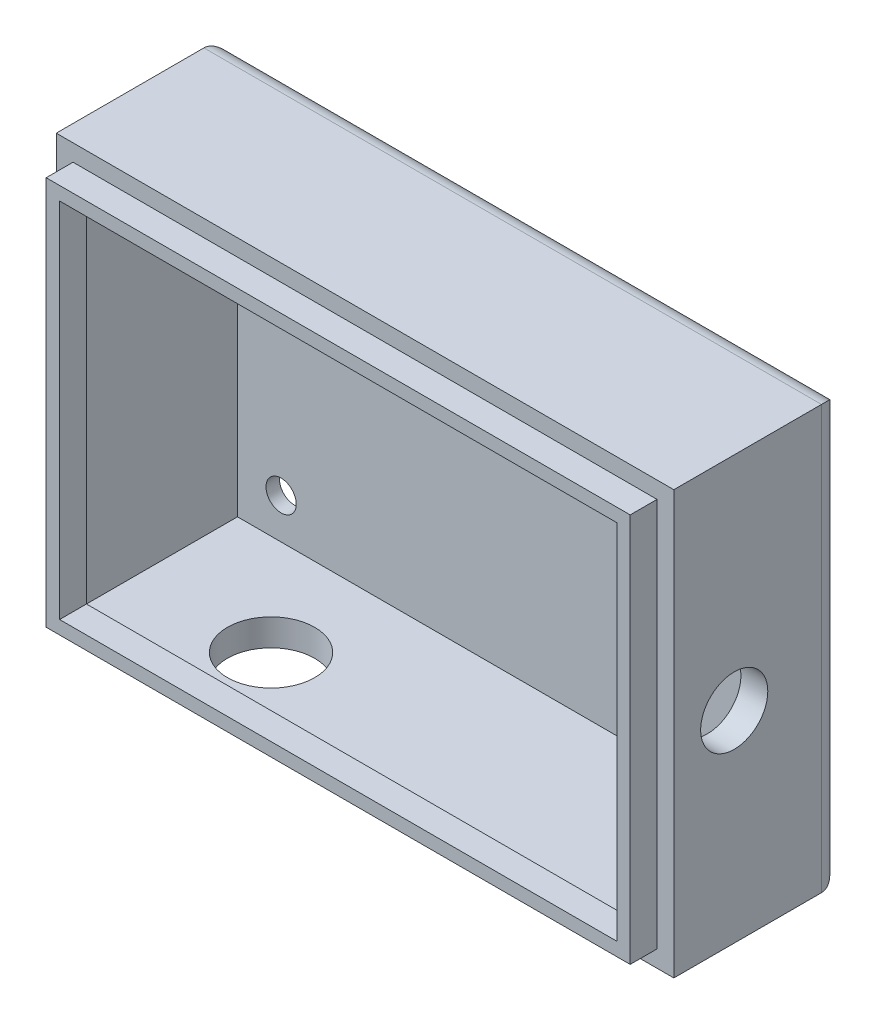
ISO-10303-21;
HEADER;
FILE_DESCRIPTION(('STEP AP214'),'2;1');
FILE_NAME('part.step','',(''),(''),'','','');
FILE_SCHEMA(('AUTOMOTIVE_DESIGN { 1 0 10303 214 1 1 1 1 }'));
ENDSEC;
DATA;
#1=APPLICATION_CONTEXT('core data for automotive mechanical design processes');
#2=APPLICATION_PROTOCOL_DEFINITION('international standard','automotive_design',2000,#1);
#3=PRODUCT_CONTEXT('',#1,'mechanical');
#4=PRODUCT('Part','Part','',(#3));
#5=PRODUCT_RELATED_PRODUCT_CATEGORY('part','',(#4));
#6=PRODUCT_DEFINITION_FORMATION('','',#4);
#7=PRODUCT_DEFINITION_CONTEXT('part definition',#1,'design');
#8=PRODUCT_DEFINITION('design','',#6,#7);
#9=PRODUCT_DEFINITION_SHAPE('','',#8);
#10=(LENGTH_UNIT() NAMED_UNIT(*) SI_UNIT(.MILLI.,.METRE.));
#11=(NAMED_UNIT(*) PLANE_ANGLE_UNIT() SI_UNIT($,.RADIAN.));
#12=(NAMED_UNIT(*) SI_UNIT($,.STERADIAN.) SOLID_ANGLE_UNIT());
#13=UNCERTAINTY_MEASURE_WITH_UNIT(LENGTH_MEASURE(1.E-05),#10,'distance_accuracy_value','');
#14=(GEOMETRIC_REPRESENTATION_CONTEXT(3) GLOBAL_UNCERTAINTY_ASSIGNED_CONTEXT((#13)) GLOBAL_UNIT_ASSIGNED_CONTEXT((#10,
#11,#12)) REPRESENTATION_CONTEXT('',''));
#15=CARTESIAN_POINT('',(0.,0.,0.));
#16=DIRECTION('',(0.,0.,1.));
#17=DIRECTION('',(1.,0.,0.));
#18=AXIS2_PLACEMENT_3D('',#15,#16,#17);
#19=CARTESIAN_POINT('',(0.,0.,25.));
#20=DIRECTION('',(0.,0.,1.));
#21=DIRECTION('',(1.,0.,0.));
#22=AXIS2_PLACEMENT_3D('',#19,#20,#21);
#23=PLANE('',#22);
#24=DIRECTION('',(1.,0.,0.));
#25=VECTOR('',#24,1.);
#26=CARTESIAN_POINT('',(0.,0.,25.));
#27=LINE('',#26,#25);
#28=CARTESIAN_POINT('',(0.,0.,25.));
#29=VERTEX_POINT('',#28);
#30=CARTESIAN_POINT('',(92.,0.,25.));
#31=VERTEX_POINT('',#30);
#32=EDGE_CURVE('E321',#29,#31,#27,.T.);
#33=ORIENTED_EDGE('',*,*,#32,.T.);
#34=DIRECTION('',(0.,1.,0.));
#35=VECTOR('',#34,1.);
#36=CARTESIAN_POINT('',(92.,0.,25.));
#37=LINE('',#36,#35);
#38=CARTESIAN_POINT('',(92.,63.,25.));
#39=VERTEX_POINT('',#38);
#40=EDGE_CURVE('E325',#31,#39,#37,.T.);
#41=ORIENTED_EDGE('',*,*,#40,.T.);
#42=DIRECTION('',(1.,0.,0.));
#43=VECTOR('',#42,1.);
#44=CARTESIAN_POINT('',(0.,63.,25.));
#45=LINE('',#44,#43);
#46=CARTESIAN_POINT('',(0.,63.,25.));
#47=VERTEX_POINT('',#46);
#48=EDGE_CURVE('E329',#47,#39,#45,.T.);
#49=ORIENTED_EDGE('',*,*,#48,.F.);
#50=DIRECTION('',(0.,1.,0.));
#51=VECTOR('',#50,1.);
#52=CARTESIAN_POINT('',(0.,0.,25.));
#53=LINE('',#52,#51);
#54=EDGE_CURVE('E333',#29,#47,#53,.T.);
#55=ORIENTED_EDGE('',*,*,#54,.F.);
#56=EDGE_LOOP('',(#33,#41,#49,#55));
#57=FACE_BOUND('',#56,.T.);
#58=DIRECTION('',(1.,0.,0.));
#59=VECTOR('',#58,1.);
#60=CARTESIAN_POINT('',(2.50000000000001,2.5,25.));
#61=LINE('',#60,#59);
#62=CARTESIAN_POINT('',(2.50000000000001,2.5,25.));
#63=VERTEX_POINT('',#62);
#64=CARTESIAN_POINT('',(89.5,2.5,25.));
#65=VERTEX_POINT('',#64);
#66=EDGE_CURVE('E235',#63,#65,#61,.T.);
#67=ORIENTED_EDGE('',*,*,#66,.F.);
#68=DIRECTION('',(0.,-1.,0.));
#69=VECTOR('',#68,1.);
#70=CARTESIAN_POINT('',(2.5,60.5,25.));
#71=LINE('',#70,#69);
#72=CARTESIAN_POINT('',(2.5,60.5,25.));
#73=VERTEX_POINT('',#72);
#74=EDGE_CURVE('E216',#73,#63,#71,.T.);
#75=ORIENTED_EDGE('',*,*,#74,.F.);
#76=DIRECTION('',(-1.,0.,0.));
#77=VECTOR('',#76,1.);
#78=CARTESIAN_POINT('',(2.5,60.5,25.));
#79=LINE('',#78,#77);
#80=CARTESIAN_POINT('',(89.5,60.5,25.));
#81=VERTEX_POINT('',#80);
#82=EDGE_CURVE('E222',#81,#73,#79,.T.);
#83=ORIENTED_EDGE('',*,*,#82,.F.);
#84=DIRECTION('',(0.,1.,0.));
#85=VECTOR('',#84,1.);
#86=CARTESIAN_POINT('',(89.5,60.5,25.));
#87=LINE('',#86,#85);
#88=EDGE_CURVE('E238',#65,#81,#87,.T.);
#89=ORIENTED_EDGE('',*,*,#88,.F.);
#90=EDGE_LOOP('',(#67,#75,#83,#89));
#91=FACE_BOUND('',#90,.T.);
#92=ADVANCED_FACE('F41',(#57,#91),#23,.T.);
#93=CARTESIAN_POINT('',(82.,53.,25.));
#94=DIRECTION('',(0.,0.,-1.));
#95=DIRECTION('',(-1.,0.,0.));
#96=AXIS2_PLACEMENT_3D('',#93,#94,#95);
#97=CYLINDRICAL_SURFACE('',#96,2.25);
#98=CARTESIAN_POINT('',(82.,53.,0.));
#99=DIRECTION('',(0.,0.,1.));
#100=DIRECTION('',(1.,0.,0.));
#101=AXIS2_PLACEMENT_3D('',#98,#99,#100);
#102=CIRCLE('',#101,2.25);
#103=CARTESIAN_POINT('',(84.25,53.,0.));
#104=VERTEX_POINT('',#103);
#105=EDGE_CURVE('E326',#104,#104,#102,.T.);
#106=ORIENTED_EDGE('',*,*,#105,.F.);
#107=EDGE_LOOP('',(#106));
#108=FACE_BOUND('',#107,.T.);
#109=CARTESIAN_POINT('',(82.,53.,2.));
#110=DIRECTION('',(0.,0.,1.));
#111=DIRECTION('',(1.,0.,0.));
#112=AXIS2_PLACEMENT_3D('',#109,#110,#111);
#113=CIRCLE('',#112,2.25);
#114=CARTESIAN_POINT('',(84.25,53.,2.));
#115=VERTEX_POINT('',#114);
#116=EDGE_CURVE('E316',#115,#115,#113,.T.);
#117=ORIENTED_EDGE('',*,*,#116,.T.);
#118=EDGE_LOOP('',(#117));
#119=FACE_BOUND('',#118,.T.);
#120=ADVANCED_FACE('F461',(#108,#119),#97,.F.);
#121=CARTESIAN_POINT('',(82.,10.,25.));
#122=DIRECTION('',(0.,0.,-1.));
#123=DIRECTION('',(-1.,0.,0.));
#124=AXIS2_PLACEMENT_3D('',#121,#122,#123);
#125=CYLINDRICAL_SURFACE('',#124,2.25);
#126=CARTESIAN_POINT('',(82.,10.,0.));
#127=DIRECTION('',(0.,0.,1.));
#128=DIRECTION('',(1.,0.,0.));
#129=AXIS2_PLACEMENT_3D('',#126,#127,#128);
#130=CIRCLE('',#129,2.25);
#131=CARTESIAN_POINT('',(84.25,10.,0.));
#132=VERTEX_POINT('',#131);
#133=EDGE_CURVE('E345',#132,#132,#130,.T.);
#134=ORIENTED_EDGE('',*,*,#133,.F.);
#135=EDGE_LOOP('',(#134));
#136=FACE_BOUND('',#135,.T.);
#137=CARTESIAN_POINT('',(82.,10.,2.));
#138=DIRECTION('',(0.,0.,1.));
#139=DIRECTION('',(1.,0.,0.));
#140=AXIS2_PLACEMENT_3D('',#137,#138,#139);
#141=CIRCLE('',#140,2.25);
#142=CARTESIAN_POINT('',(84.25,10.,2.));
#143=VERTEX_POINT('',#142);
#144=EDGE_CURVE('E312',#143,#143,#141,.T.);
#145=ORIENTED_EDGE('',*,*,#144,.T.);
#146=EDGE_LOOP('',(#145));
#147=FACE_BOUND('',#146,.T.);
#148=ADVANCED_FACE('F531',(#136,#147),#125,.F.);
#149=CARTESIAN_POINT('',(10.5,10.,25.));
#150=DIRECTION('',(0.,0.,-1.));
#151=DIRECTION('',(-1.,0.,0.));
#152=AXIS2_PLACEMENT_3D('',#149,#150,#151);
#153=CYLINDRICAL_SURFACE('',#152,2.25);
#154=CARTESIAN_POINT('',(10.5,10.,0.));
#155=DIRECTION('',(0.,0.,1.));
#156=DIRECTION('',(1.,0.,0.));
#157=AXIS2_PLACEMENT_3D('',#154,#155,#156);
#158=CIRCLE('',#157,2.25);
#159=CARTESIAN_POINT('',(12.75,10.,0.));
#160=VERTEX_POINT('',#159);
#161=EDGE_CURVE('E341',#160,#160,#158,.T.);
#162=ORIENTED_EDGE('',*,*,#161,.F.);
#163=EDGE_LOOP('',(#162));
#164=FACE_BOUND('',#163,.T.);
#165=CARTESIAN_POINT('',(10.5,10.,2.));
#166=DIRECTION('',(0.,0.,1.));
#167=DIRECTION('',(1.,0.,0.));
#168=AXIS2_PLACEMENT_3D('',#165,#166,#167);
#169=CIRCLE('',#168,2.25);
#170=CARTESIAN_POINT('',(12.75,10.,2.));
#171=VERTEX_POINT('',#170);
#172=EDGE_CURVE('E308',#171,#171,#169,.T.);
#173=ORIENTED_EDGE('',*,*,#172,.T.);
#174=EDGE_LOOP('',(#173));
#175=FACE_BOUND('',#174,.T.);
#176=ADVANCED_FACE('F535',(#164,#175),#153,.F.);
#177=CARTESIAN_POINT('',(10.5,53.,25.));
#178=DIRECTION('',(0.,0.,-1.));
#179=DIRECTION('',(-1.,0.,0.));
#180=AXIS2_PLACEMENT_3D('',#177,#178,#179);
#181=CYLINDRICAL_SURFACE('',#180,2.25);
#182=CARTESIAN_POINT('',(10.5,53.,0.));
#183=DIRECTION('',(0.,0.,1.));
#184=DIRECTION('',(1.,0.,0.));
#185=AXIS2_PLACEMENT_3D('',#182,#183,#184);
#186=CIRCLE('',#185,2.25);
#187=CARTESIAN_POINT('',(12.75,53.,0.));
#188=VERTEX_POINT('',#187);
#189=EDGE_CURVE('E320',#188,#188,#186,.T.);
#190=ORIENTED_EDGE('',*,*,#189,.F.);
#191=EDGE_LOOP('',(#190));
#192=FACE_BOUND('',#191,.T.);
#193=CARTESIAN_POINT('',(10.5,53.,2.));
#194=DIRECTION('',(0.,0.,1.));
#195=DIRECTION('',(1.,0.,0.));
#196=AXIS2_PLACEMENT_3D('',#193,#194,#195);
#197=CIRCLE('',#196,2.25);
#198=CARTESIAN_POINT('',(12.75,53.,2.));
#199=VERTEX_POINT('',#198);
#200=EDGE_CURVE('E296',#199,#199,#197,.T.);
#201=ORIENTED_EDGE('',*,*,#200,.T.);
#202=EDGE_LOOP('',(#201));
#203=FACE_BOUND('',#202,.T.);
#204=ADVANCED_FACE('F527',(#192,#203),#181,.F.);
#205=CARTESIAN_POINT('',(0.,0.,25.));
#206=DIRECTION('',(0.,1.,0.));
#207=DIRECTION('',(0.,0.,1.));
#208=AXIS2_PLACEMENT_3D('',#205,#206,#207);
#209=PLANE('',#208);
#210=CARTESIAN_POINT('',(24.,0.,17.));
#211=DIRECTION('',(0.,-1.,0.));
#212=DIRECTION('',(0.,0.,-1.));
#213=AXIS2_PLACEMENT_3D('',#210,#211,#212);
#214=CIRCLE('',#213,6.5);
#215=CARTESIAN_POINT('',(24.,0.,10.5));
#216=VERTEX_POINT('',#215);
#217=EDGE_CURVE('E406',#216,#216,#214,.T.);
#218=ORIENTED_EDGE('',*,*,#217,.F.);
#219=EDGE_LOOP('',(#218));
#220=FACE_BOUND('',#219,.T.);
#221=DIRECTION('',(0.,0.,-1.));
#222=VECTOR('',#221,1.);
#223=CARTESIAN_POINT('',(0.,0.,25.));
#224=LINE('',#223,#222);
#225=CARTESIAN_POINT('',(0.,0.,3.));
#226=VERTEX_POINT('',#225);
#227=EDGE_CURVE('E337',#29,#226,#224,.T.);
#228=ORIENTED_EDGE('',*,*,#227,.T.);
#229=DIRECTION('',(1.,0.,0.));
#230=VECTOR('',#229,1.);
#231=CARTESIAN_POINT('',(0.,0.,3.));
#232=LINE('',#231,#230);
#233=CARTESIAN_POINT('',(92.,0.,3.));
#234=VERTEX_POINT('',#233);
#235=EDGE_CURVE('E367',#226,#234,#232,.T.);
#236=ORIENTED_EDGE('',*,*,#235,.T.);
#237=DIRECTION('',(0.,0.,-1.));
#238=VECTOR('',#237,1.);
#239=CARTESIAN_POINT('',(92.,0.,25.));
#240=LINE('',#239,#238);
#241=EDGE_CURVE('E363',#31,#234,#240,.T.);
#242=ORIENTED_EDGE('',*,*,#241,.F.);
#243=ORIENTED_EDGE('',*,*,#32,.F.);
#244=EDGE_LOOP('',(#228,#236,#242,#243));
#245=FACE_BOUND('',#244,.T.);
#246=ADVANCED_FACE('F430',(#220,#245),#209,.F.);
#247=CARTESIAN_POINT('',(92.,0.,25.));
#248=DIRECTION('',(-1.,0.,0.));
#249=DIRECTION('',(0.,0.,1.));
#250=AXIS2_PLACEMENT_3D('',#247,#248,#249);
#251=PLANE('',#250);
#252=CARTESIAN_POINT('',(92.,30.,16.));
#253=DIRECTION('',(1.,0.,0.));
#254=DIRECTION('',(0.,0.,-1.));
#255=AXIS2_PLACEMENT_3D('',#252,#253,#254);
#256=CIRCLE('',#255,5.);
#257=CARTESIAN_POINT('',(92.,30.,11.));
#258=VERTEX_POINT('',#257);
#259=EDGE_CURVE('E417',#258,#258,#256,.T.);
#260=ORIENTED_EDGE('',*,*,#259,.F.);
#261=EDGE_LOOP('',(#260));
#262=FACE_BOUND('',#261,.T.);
#263=ORIENTED_EDGE('',*,*,#241,.T.);
#264=DIRECTION('',(0.,1.,0.));
#265=VECTOR('',#264,1.);
#266=CARTESIAN_POINT('',(92.,0.,3.));
#267=LINE('',#266,#265);
#268=CARTESIAN_POINT('',(92.,63.,3.));
#269=VERTEX_POINT('',#268);
#270=EDGE_CURVE('E11',#234,#269,#267,.T.);
#271=ORIENTED_EDGE('',*,*,#270,.T.);
#272=DIRECTION('',(0.,0.,-1.));
#273=VECTOR('',#272,1.);
#274=CARTESIAN_POINT('',(92.,63.,25.));
#275=LINE('',#274,#273);
#276=EDGE_CURVE('E359',#39,#269,#275,.T.);
#277=ORIENTED_EDGE('',*,*,#276,.F.);
#278=ORIENTED_EDGE('',*,*,#40,.F.);
#279=EDGE_LOOP('',(#263,#271,#277,#278));
#280=FACE_BOUND('',#279,.T.);
#281=ADVANCED_FACE('F426',(#262,#280),#251,.F.);
#282=CARTESIAN_POINT('',(0.,63.,25.));
#283=DIRECTION('',(0.,1.,0.));
#284=DIRECTION('',(0.,0.,1.));
#285=AXIS2_PLACEMENT_3D('',#282,#283,#284);
#286=PLANE('',#285);
#287=ORIENTED_EDGE('',*,*,#276,.T.);
#288=DIRECTION('',(1.,0.,0.));
#289=VECTOR('',#288,1.);
#290=CARTESIAN_POINT('',(0.,63.,3.));
#291=LINE('',#290,#289);
#292=CARTESIAN_POINT('',(0.,63.,3.));
#293=VERTEX_POINT('',#292);
#294=EDGE_CURVE('E51',#269,#293,#291,.F.);
#295=ORIENTED_EDGE('',*,*,#294,.T.);
#296=DIRECTION('',(0.,0.,-1.));
#297=VECTOR('',#296,1.);
#298=CARTESIAN_POINT('',(0.,63.,25.));
#299=LINE('',#298,#297);
#300=EDGE_CURVE('E355',#47,#293,#299,.T.);
#301=ORIENTED_EDGE('',*,*,#300,.F.);
#302=ORIENTED_EDGE('',*,*,#48,.T.);
#303=EDGE_LOOP('',(#287,#295,#301,#302));
#304=FACE_BOUND('',#303,.T.);
#305=ADVANCED_FACE('F429',(#304),#286,.T.);
#306=CARTESIAN_POINT('',(0.,0.,25.));
#307=DIRECTION('',(-1.,0.,0.));
#308=DIRECTION('',(0.,0.,1.));
#309=AXIS2_PLACEMENT_3D('',#306,#307,#308);
#310=PLANE('',#309);
#311=ORIENTED_EDGE('',*,*,#300,.T.);
#312=DIRECTION('',(0.,1.,0.));
#313=VECTOR('',#312,1.);
#314=CARTESIAN_POINT('',(0.,0.,3.));
#315=LINE('',#314,#313);
#316=EDGE_CURVE('E387',#293,#226,#315,.F.);
#317=ORIENTED_EDGE('',*,*,#316,.T.);
#318=ORIENTED_EDGE('',*,*,#227,.F.);
#319=ORIENTED_EDGE('',*,*,#54,.T.);
#320=EDGE_LOOP('',(#311,#317,#318,#319));
#321=FACE_BOUND('',#320,.T.);
#322=ADVANCED_FACE('F457',(#321),#310,.T.);
#323=CARTESIAN_POINT('',(0.,0.,0.));
#324=DIRECTION('',(0.,0.,1.));
#325=DIRECTION('',(1.,0.,0.));
#326=AXIS2_PLACEMENT_3D('',#323,#324,#325);
#327=PLANE('',#326);
#328=DIRECTION('',(0.,1.,0.));
#329=VECTOR('',#328,1.);
#330=CARTESIAN_POINT('',(89.,0.,0.));
#331=LINE('',#330,#329);
#332=CARTESIAN_POINT('',(89.,60.,0.));
#333=VERTEX_POINT('',#332);
#334=CARTESIAN_POINT('',(89.,3.,0.));
#335=VERTEX_POINT('',#334);
#336=EDGE_CURVE('E374',#333,#335,#331,.F.);
#337=ORIENTED_EDGE('',*,*,#336,.T.);
#338=DIRECTION('',(1.,0.,0.));
#339=VECTOR('',#338,1.);
#340=CARTESIAN_POINT('',(0.,3.,0.));
#341=LINE('',#340,#339);
#342=CARTESIAN_POINT('',(3.,3.,0.));
#343=VERTEX_POINT('',#342);
#344=EDGE_CURVE('E383',#335,#343,#341,.F.);
#345=ORIENTED_EDGE('',*,*,#344,.T.);
#346=DIRECTION('',(0.,1.,0.));
#347=VECTOR('',#346,1.);
#348=CARTESIAN_POINT('',(3.,63.,0.));
#349=LINE('',#348,#347);
#350=CARTESIAN_POINT('',(3.,60.,0.));
#351=VERTEX_POINT('',#350);
#352=EDGE_CURVE('E380',#343,#351,#349,.T.);
#353=ORIENTED_EDGE('',*,*,#352,.T.);
#354=DIRECTION('',(1.,0.,0.));
#355=VECTOR('',#354,1.);
#356=CARTESIAN_POINT('',(92.,60.,0.));
#357=LINE('',#356,#355);
#358=EDGE_CURVE('E377',#351,#333,#357,.T.);
#359=ORIENTED_EDGE('',*,*,#358,.T.);
#360=EDGE_LOOP('',(#337,#345,#353,#359));
#361=FACE_BOUND('',#360,.T.);
#362=ORIENTED_EDGE('',*,*,#189,.T.);
#363=EDGE_LOOP('',(#362));
#364=FACE_BOUND('',#363,.T.);
#365=ORIENTED_EDGE('',*,*,#161,.T.);
#366=EDGE_LOOP('',(#365));
#367=FACE_BOUND('',#366,.T.);
#368=ORIENTED_EDGE('',*,*,#133,.T.);
#369=EDGE_LOOP('',(#368));
#370=FACE_BOUND('',#369,.T.);
#371=ORIENTED_EDGE('',*,*,#105,.T.);
#372=EDGE_LOOP('',(#371));
#373=FACE_BOUND('',#372,.T.);
#374=ADVANCED_FACE('F515',(#361,#364,#367,#370,#373),#327,.F.);
#375=CARTESIAN_POINT('',(4.,59.,2.));
#376=DIRECTION('',(-1.,0.,0.));
#377=DIRECTION('',(0.,-1.,0.));
#378=AXIS2_PLACEMENT_3D('',#375,#376,#377);
#379=PLANE('',#378);
#380=DIRECTION('',(0.,-1.,0.));
#381=VECTOR('',#380,1.);
#382=CARTESIAN_POINT('',(4.,59.,25.));
#383=LINE('',#382,#381);
#384=CARTESIAN_POINT('',(4.,59.,25.));
#385=VERTEX_POINT('',#384);
#386=CARTESIAN_POINT('',(4.00000000000001,4.,25.));
#387=VERTEX_POINT('',#386);
#388=EDGE_CURVE('E276',#385,#387,#383,.T.);
#389=ORIENTED_EDGE('',*,*,#388,.T.);
#390=DIRECTION('',(0.,0.,1.));
#391=VECTOR('',#390,1.);
#392=CARTESIAN_POINT('',(4.00000000000001,4.,2.));
#393=LINE('',#392,#391);
#394=CARTESIAN_POINT('',(4.00000000000001,4.,2.));
#395=VERTEX_POINT('',#394);
#396=EDGE_CURVE('E275',#395,#387,#393,.T.);
#397=ORIENTED_EDGE('',*,*,#396,.F.);
#398=DIRECTION('',(0.,-1.,0.));
#399=VECTOR('',#398,1.);
#400=CARTESIAN_POINT('',(4.,59.,2.));
#401=LINE('',#400,#399);
#402=CARTESIAN_POINT('',(4.,59.,2.));
#403=VERTEX_POINT('',#402);
#404=EDGE_CURVE('E258',#403,#395,#401,.T.);
#405=ORIENTED_EDGE('',*,*,#404,.F.);
#406=DIRECTION('',(0.,0.,1.));
#407=VECTOR('',#406,1.);
#408=CARTESIAN_POINT('',(4.,59.,2.));
#409=LINE('',#408,#407);
#410=EDGE_CURVE('E292',#403,#385,#409,.T.);
#411=ORIENTED_EDGE('',*,*,#410,.T.);
#412=EDGE_LOOP('',(#389,#397,#405,#411));
#413=FACE_BOUND('',#412,.T.);
#414=ADVANCED_FACE('F507',(#413),#379,.F.);
#415=CARTESIAN_POINT('',(4.,59.,2.));
#416=DIRECTION('',(0.,1.,0.));
#417=DIRECTION('',(0.,0.,1.));
#418=AXIS2_PLACEMENT_3D('',#415,#416,#417);
#419=PLANE('',#418);
#420=DIRECTION('',(-1.,0.,0.));
#421=VECTOR('',#420,1.);
#422=CARTESIAN_POINT('',(4.,59.,25.));
#423=LINE('',#422,#421);
#424=CARTESIAN_POINT('',(88.,59.,25.));
#425=VERTEX_POINT('',#424);
#426=EDGE_CURVE('E263',#425,#385,#423,.T.);
#427=ORIENTED_EDGE('',*,*,#426,.T.);
#428=ORIENTED_EDGE('',*,*,#410,.F.);
#429=DIRECTION('',(-1.,0.,0.));
#430=VECTOR('',#429,1.);
#431=CARTESIAN_POINT('',(4.,59.,2.));
#432=LINE('',#431,#430);
#433=CARTESIAN_POINT('',(88.,59.,2.));
#434=VERTEX_POINT('',#433);
#435=EDGE_CURVE('E271',#434,#403,#432,.T.);
#436=ORIENTED_EDGE('',*,*,#435,.F.);
#437=DIRECTION('',(0.,0.,1.));
#438=VECTOR('',#437,1.);
#439=CARTESIAN_POINT('',(88.,59.,2.));
#440=LINE('',#439,#438);
#441=EDGE_CURVE('E297',#434,#425,#440,.T.);
#442=ORIENTED_EDGE('',*,*,#441,.T.);
#443=EDGE_LOOP('',(#427,#428,#436,#442));
#444=FACE_BOUND('',#443,.T.);
#445=ADVANCED_FACE('F503',(#444),#419,.F.);
#446=CARTESIAN_POINT('',(88.,59.,2.));
#447=DIRECTION('',(1.,0.,0.));
#448=DIRECTION('',(0.,0.,-1.));
#449=AXIS2_PLACEMENT_3D('',#446,#447,#448);
#450=PLANE('',#449);
#451=CARTESIAN_POINT('',(88.,30.,16.));
#452=DIRECTION('',(1.,0.,0.));
#453=DIRECTION('',(0.,0.,-1.));
#454=AXIS2_PLACEMENT_3D('',#451,#452,#453);
#455=CIRCLE('',#454,5.);
#456=CARTESIAN_POINT('',(88.,30.,11.));
#457=VERTEX_POINT('',#456);
#458=EDGE_CURVE('E45',#457,#457,#455,.T.);
#459=ORIENTED_EDGE('',*,*,#458,.T.);
#460=EDGE_LOOP('',(#459));
#461=FACE_BOUND('',#460,.T.);
#462=DIRECTION('',(0.,1.,0.));
#463=VECTOR('',#462,1.);
#464=CARTESIAN_POINT('',(88.,59.,25.));
#465=LINE('',#464,#463);
#466=CARTESIAN_POINT('',(88.,4.,25.));
#467=VERTEX_POINT('',#466);
#468=EDGE_CURVE('E285',#467,#425,#465,.T.);
#469=ORIENTED_EDGE('',*,*,#468,.T.);
#470=ORIENTED_EDGE('',*,*,#441,.F.);
#471=DIRECTION('',(0.,1.,0.));
#472=VECTOR('',#471,1.);
#473=CARTESIAN_POINT('',(88.,59.,2.));
#474=LINE('',#473,#472);
#475=CARTESIAN_POINT('',(88.,4.,2.));
#476=VERTEX_POINT('',#475);
#477=EDGE_CURVE('E267',#476,#434,#474,.T.);
#478=ORIENTED_EDGE('',*,*,#477,.F.);
#479=DIRECTION('',(0.,0.,1.));
#480=VECTOR('',#479,1.);
#481=CARTESIAN_POINT('',(88.,4.,2.));
#482=LINE('',#481,#480);
#483=EDGE_CURVE('E301',#476,#467,#482,.T.);
#484=ORIENTED_EDGE('',*,*,#483,.T.);
#485=EDGE_LOOP('',(#469,#470,#478,#484));
#486=FACE_BOUND('',#485,.T.);
#487=ADVANCED_FACE('F506',(#461,#486),#450,.F.);
#488=CARTESIAN_POINT('',(4.00000000000001,4.,2.));
#489=DIRECTION('',(0.,-1.,0.));
#490=DIRECTION('',(0.,0.,-1.));
#491=AXIS2_PLACEMENT_3D('',#488,#489,#490);
#492=PLANE('',#491);
#493=CARTESIAN_POINT('',(24.,4.,17.));
#494=DIRECTION('',(0.,-1.,0.));
#495=DIRECTION('',(0.,0.,-1.));
#496=AXIS2_PLACEMENT_3D('',#493,#494,#495);
#497=CIRCLE('',#496,6.5);
#498=CARTESIAN_POINT('',(24.,4.,10.5));
#499=VERTEX_POINT('',#498);
#500=EDGE_CURVE('E403',#499,#499,#497,.T.);
#501=ORIENTED_EDGE('',*,*,#500,.T.);
#502=EDGE_LOOP('',(#501));
#503=FACE_BOUND('',#502,.T.);
#504=DIRECTION('',(1.,0.,0.));
#505=VECTOR('',#504,1.);
#506=CARTESIAN_POINT('',(4.00000000000001,4.,25.));
#507=LINE('',#506,#505);
#508=EDGE_CURVE('E280',#387,#467,#507,.T.);
#509=ORIENTED_EDGE('',*,*,#508,.T.);
#510=ORIENTED_EDGE('',*,*,#483,.F.);
#511=DIRECTION('',(1.,0.,0.));
#512=VECTOR('',#511,1.);
#513=CARTESIAN_POINT('',(4.00000000000001,4.,2.));
#514=LINE('',#513,#512);
#515=EDGE_CURVE('E262',#395,#476,#514,.T.);
#516=ORIENTED_EDGE('',*,*,#515,.F.);
#517=ORIENTED_EDGE('',*,*,#396,.T.);
#518=EDGE_LOOP('',(#509,#510,#516,#517));
#519=FACE_BOUND('',#518,.T.);
#520=ADVANCED_FACE('F501',(#503,#519),#492,.F.);
#521=CARTESIAN_POINT('',(0.,0.,2.));
#522=DIRECTION('',(0.,0.,1.));
#523=DIRECTION('',(1.,0.,0.));
#524=AXIS2_PLACEMENT_3D('',#521,#522,#523);
#525=PLANE('',#524);
#526=ORIENTED_EDGE('',*,*,#404,.T.);
#527=ORIENTED_EDGE('',*,*,#515,.T.);
#528=ORIENTED_EDGE('',*,*,#477,.T.);
#529=ORIENTED_EDGE('',*,*,#435,.T.);
#530=EDGE_LOOP('',(#526,#527,#528,#529));
#531=FACE_BOUND('',#530,.T.);
#532=ORIENTED_EDGE('',*,*,#200,.F.);
#533=EDGE_LOOP('',(#532));
#534=FACE_BOUND('',#533,.T.);
#535=ORIENTED_EDGE('',*,*,#172,.F.);
#536=EDGE_LOOP('',(#535));
#537=FACE_BOUND('',#536,.T.);
#538=ORIENTED_EDGE('',*,*,#144,.F.);
#539=EDGE_LOOP('',(#538));
#540=FACE_BOUND('',#539,.T.);
#541=ORIENTED_EDGE('',*,*,#116,.F.);
#542=EDGE_LOOP('',(#541));
#543=FACE_BOUND('',#542,.T.);
#544=ADVANCED_FACE('F498',(#531,#534,#537,#540,#543),#525,.T.);
#545=CARTESIAN_POINT('',(0.,60.,3.));
#546=DIRECTION('',(-1.,0.,0.));
#547=DIRECTION('',(0.,0.,1.));
#548=AXIS2_PLACEMENT_3D('',#545,#546,#547);
#549=CYLINDRICAL_SURFACE('',#548,3.);
#550=CARTESIAN_POINT('',(89.,60.,3.));
#551=DIRECTION('',(-0.707106781186547,0.707106781186547,0.));
#552=DIRECTION('',(0.707106781186547,0.707106781186547,0.));
#553=AXIS2_PLACEMENT_3D('',#550,#551,#552);
#554=ELLIPSE('',#553,4.24264068711928,3.);
#555=EDGE_CURVE('E397',#333,#269,#554,.F.);
#556=ORIENTED_EDGE('',*,*,#555,.F.);
#557=ORIENTED_EDGE('',*,*,#358,.F.);
#558=CARTESIAN_POINT('',(3.,60.,3.));
#559=DIRECTION('',(-0.707106781186547,-0.707106781186547,0.));
#560=DIRECTION('',(-0.707106781186547,0.707106781186547,0.));
#561=AXIS2_PLACEMENT_3D('',#558,#559,#560);
#562=ELLIPSE('',#561,4.24264068711928,3.);
#563=EDGE_CURVE('E281',#293,#351,#562,.T.);
#564=ORIENTED_EDGE('',*,*,#563,.F.);
#565=ORIENTED_EDGE('',*,*,#294,.F.);
#566=EDGE_LOOP('',(#556,#557,#564,#565));
#567=FACE_BOUND('',#566,.T.);
#568=ADVANCED_FACE('F43',(#567),#549,.T.);
#569=CARTESIAN_POINT('',(3.,0.,3.));
#570=DIRECTION('',(0.,-1.,0.));
#571=DIRECTION('',(0.,0.,-1.));
#572=AXIS2_PLACEMENT_3D('',#569,#570,#571);
#573=CYLINDRICAL_SURFACE('',#572,3.);
#574=ORIENTED_EDGE('',*,*,#563,.T.);
#575=ORIENTED_EDGE('',*,*,#352,.F.);
#576=CARTESIAN_POINT('',(3.,3.,3.));
#577=DIRECTION('',(0.707106781186547,-0.707106781186547,0.));
#578=DIRECTION('',(-0.707106781186547,-0.707106781186547,0.));
#579=AXIS2_PLACEMENT_3D('',#576,#577,#578);
#580=ELLIPSE('',#579,4.24264068711928,3.);
#581=EDGE_CURVE('E394',#226,#343,#580,.T.);
#582=ORIENTED_EDGE('',*,*,#581,.F.);
#583=ORIENTED_EDGE('',*,*,#316,.F.);
#584=EDGE_LOOP('',(#574,#575,#582,#583));
#585=FACE_BOUND('',#584,.T.);
#586=ADVANCED_FACE('F546',(#585),#573,.T.);
#587=CARTESIAN_POINT('',(89.,0.,3.));
#588=DIRECTION('',(0.,1.,0.));
#589=DIRECTION('',(0.,0.,1.));
#590=AXIS2_PLACEMENT_3D('',#587,#588,#589);
#591=CYLINDRICAL_SURFACE('',#590,3.);
#592=ORIENTED_EDGE('',*,*,#555,.T.);
#593=ORIENTED_EDGE('',*,*,#270,.F.);
#594=CARTESIAN_POINT('',(89.,3.,3.));
#595=DIRECTION('',(0.707106781186547,0.707106781186547,0.));
#596=DIRECTION('',(-0.707106781186547,0.707106781186547,0.));
#597=AXIS2_PLACEMENT_3D('',#594,#595,#596);
#598=ELLIPSE('',#597,4.24264068711928,3.);
#599=EDGE_CURVE('E257',#335,#234,#598,.F.);
#600=ORIENTED_EDGE('',*,*,#599,.F.);
#601=ORIENTED_EDGE('',*,*,#336,.F.);
#602=EDGE_LOOP('',(#592,#593,#600,#601));
#603=FACE_BOUND('',#602,.T.);
#604=ADVANCED_FACE('F447',(#603),#591,.T.);
#605=CARTESIAN_POINT('',(0.,3.,3.));
#606=DIRECTION('',(1.,0.,0.));
#607=DIRECTION('',(0.,0.,-1.));
#608=AXIS2_PLACEMENT_3D('',#605,#606,#607);
#609=CYLINDRICAL_SURFACE('',#608,3.);
#610=ORIENTED_EDGE('',*,*,#581,.T.);
#611=ORIENTED_EDGE('',*,*,#344,.F.);
#612=ORIENTED_EDGE('',*,*,#599,.T.);
#613=ORIENTED_EDGE('',*,*,#235,.F.);
#614=EDGE_LOOP('',(#610,#611,#612,#613));
#615=FACE_BOUND('',#614,.T.);
#616=ADVANCED_FACE('F441',(#615),#609,.T.);
#617=CARTESIAN_POINT('',(0.,0.,25.));
#618=DIRECTION('',(0.,0.,1.));
#619=DIRECTION('',(1.,0.,0.));
#620=AXIS2_PLACEMENT_3D('',#617,#618,#619);
#621=PLANE('',#620);
#622=DIRECTION('',(-1.,0.,0.));
#623=VECTOR('',#622,1.);
#624=CARTESIAN_POINT('',(0.,58.5,25.));
#625=LINE('',#624,#623);
#626=CARTESIAN_POINT('',(87.5,58.5,25.));
#627=VERTEX_POINT('',#626);
#628=CARTESIAN_POINT('',(4.5,58.5,25.));
#629=VERTEX_POINT('',#628);
#630=EDGE_CURVE('E208',#627,#629,#625,.T.);
#631=ORIENTED_EDGE('',*,*,#630,.T.);
#632=DIRECTION('',(0.,-1.,0.));
#633=VECTOR('',#632,1.);
#634=CARTESIAN_POINT('',(4.5,0.,25.));
#635=LINE('',#634,#633);
#636=CARTESIAN_POINT('',(4.5,4.5,25.));
#637=VERTEX_POINT('',#636);
#638=EDGE_CURVE('E212',#629,#637,#635,.T.);
#639=ORIENTED_EDGE('',*,*,#638,.T.);
#640=DIRECTION('',(1.,0.,0.));
#641=VECTOR('',#640,1.);
#642=CARTESIAN_POINT('',(0.,4.5,25.));
#643=LINE('',#642,#641);
#644=CARTESIAN_POINT('',(87.5,4.5,25.));
#645=VERTEX_POINT('',#644);
#646=EDGE_CURVE('E199',#637,#645,#643,.T.);
#647=ORIENTED_EDGE('',*,*,#646,.T.);
#648=DIRECTION('',(0.,1.,0.));
#649=VECTOR('',#648,1.);
#650=CARTESIAN_POINT('',(87.5,0.,25.));
#651=LINE('',#650,#649);
#652=EDGE_CURVE('E174',#645,#627,#651,.T.);
#653=ORIENTED_EDGE('',*,*,#652,.T.);
#654=EDGE_LOOP('',(#631,#639,#647,#653));
#655=FACE_BOUND('',#654,.T.);
#656=ORIENTED_EDGE('',*,*,#508,.F.);
#657=ORIENTED_EDGE('',*,*,#388,.F.);
#658=ORIENTED_EDGE('',*,*,#426,.F.);
#659=ORIENTED_EDGE('',*,*,#468,.F.);
#660=EDGE_LOOP('',(#656,#657,#658,#659));
#661=FACE_BOUND('',#660,.T.);
#662=ADVANCED_FACE('F492',(#655,#661),#621,.F.);
#663=CARTESIAN_POINT('',(2.5,60.5,29.));
#664=DIRECTION('',(1.,0.,0.));
#665=DIRECTION('',(0.,1.,0.));
#666=AXIS2_PLACEMENT_3D('',#663,#664,#665);
#667=PLANE('',#666);
#668=ORIENTED_EDGE('',*,*,#74,.T.);
#669=DIRECTION('',(0.,0.,-1.));
#670=VECTOR('',#669,1.);
#671=CARTESIAN_POINT('',(2.50000000000001,2.5,29.));
#672=LINE('',#671,#670);
#673=CARTESIAN_POINT('',(2.50000000000001,2.5,29.));
#674=VERTEX_POINT('',#673);
#675=EDGE_CURVE('E254',#674,#63,#672,.T.);
#676=ORIENTED_EDGE('',*,*,#675,.F.);
#677=DIRECTION('',(0.,-1.,0.));
#678=VECTOR('',#677,1.);
#679=CARTESIAN_POINT('',(2.5,60.5,29.));
#680=LINE('',#679,#678);
#681=CARTESIAN_POINT('',(2.5,60.5,29.));
#682=VERTEX_POINT('',#681);
#683=EDGE_CURVE('E217',#682,#674,#680,.T.);
#684=ORIENTED_EDGE('',*,*,#683,.F.);
#685=DIRECTION('',(0.,0.,-1.));
#686=VECTOR('',#685,1.);
#687=CARTESIAN_POINT('',(2.5,60.5,29.));
#688=LINE('',#687,#686);
#689=EDGE_CURVE('E231',#682,#73,#688,.T.);
#690=ORIENTED_EDGE('',*,*,#689,.T.);
#691=EDGE_LOOP('',(#668,#676,#684,#690));
#692=FACE_BOUND('',#691,.T.);
#693=ADVANCED_FACE('F479',(#692),#667,.F.);
#694=CARTESIAN_POINT('',(2.50000000000001,2.5,29.));
#695=DIRECTION('',(0.,1.,0.));
#696=DIRECTION('',(0.,0.,1.));
#697=AXIS2_PLACEMENT_3D('',#694,#695,#696);
#698=PLANE('',#697);
#699=ORIENTED_EDGE('',*,*,#66,.T.);
#700=DIRECTION('',(0.,0.,-1.));
#701=VECTOR('',#700,1.);
#702=CARTESIAN_POINT('',(89.5,2.5,29.));
#703=LINE('',#702,#701);
#704=CARTESIAN_POINT('',(89.5,2.5,29.));
#705=VERTEX_POINT('',#704);
#706=EDGE_CURVE('E250',#705,#65,#703,.T.);
#707=ORIENTED_EDGE('',*,*,#706,.F.);
#708=DIRECTION('',(1.,0.,0.));
#709=VECTOR('',#708,1.);
#710=CARTESIAN_POINT('',(2.50000000000001,2.5,29.));
#711=LINE('',#710,#709);
#712=EDGE_CURVE('E221',#674,#705,#711,.T.);
#713=ORIENTED_EDGE('',*,*,#712,.F.);
#714=ORIENTED_EDGE('',*,*,#675,.T.);
#715=EDGE_LOOP('',(#699,#707,#713,#714));
#716=FACE_BOUND('',#715,.T.);
#717=ADVANCED_FACE('F469',(#716),#698,.F.);
#718=CARTESIAN_POINT('',(89.5,60.5,29.));
#719=DIRECTION('',(-1.,0.,0.));
#720=DIRECTION('',(0.,-1.,0.));
#721=AXIS2_PLACEMENT_3D('',#718,#719,#720);
#722=PLANE('',#721);
#723=ORIENTED_EDGE('',*,*,#88,.T.);
#724=DIRECTION('',(0.,0.,-1.));
#725=VECTOR('',#724,1.);
#726=CARTESIAN_POINT('',(89.5,60.5,29.));
#727=LINE('',#726,#725);
#728=CARTESIAN_POINT('',(89.5,60.5,29.));
#729=VERTEX_POINT('',#728);
#730=EDGE_CURVE('E247',#729,#81,#727,.T.);
#731=ORIENTED_EDGE('',*,*,#730,.F.);
#732=DIRECTION('',(0.,1.,0.));
#733=VECTOR('',#732,1.);
#734=CARTESIAN_POINT('',(89.5,60.5,29.));
#735=LINE('',#734,#733);
#736=EDGE_CURVE('E225',#705,#729,#735,.T.);
#737=ORIENTED_EDGE('',*,*,#736,.F.);
#738=ORIENTED_EDGE('',*,*,#706,.T.);
#739=EDGE_LOOP('',(#723,#731,#737,#738));
#740=FACE_BOUND('',#739,.T.);
#741=ADVANCED_FACE('F473',(#740),#722,.F.);
#742=CARTESIAN_POINT('',(2.5,60.5,29.));
#743=DIRECTION('',(0.,-1.,0.));
#744=DIRECTION('',(0.,0.,-1.));
#745=AXIS2_PLACEMENT_3D('',#742,#743,#744);
#746=PLANE('',#745);
#747=ORIENTED_EDGE('',*,*,#82,.T.);
#748=ORIENTED_EDGE('',*,*,#689,.F.);
#749=DIRECTION('',(-1.,0.,0.));
#750=VECTOR('',#749,1.);
#751=CARTESIAN_POINT('',(2.5,60.5,29.));
#752=LINE('',#751,#750);
#753=EDGE_CURVE('E228',#729,#682,#752,.T.);
#754=ORIENTED_EDGE('',*,*,#753,.F.);
#755=ORIENTED_EDGE('',*,*,#730,.T.);
#756=EDGE_LOOP('',(#747,#748,#754,#755));
#757=FACE_BOUND('',#756,.T.);
#758=ADVANCED_FACE('F481',(#757),#746,.F.);
#759=CARTESIAN_POINT('',(0.,0.,29.));
#760=DIRECTION('',(0.,0.,1.));
#761=DIRECTION('',(1.,0.,0.));
#762=AXIS2_PLACEMENT_3D('',#759,#760,#761);
#763=PLANE('',#762);
#764=DIRECTION('',(0.,-1.,0.));
#765=VECTOR('',#764,1.);
#766=CARTESIAN_POINT('',(4.5,4.5,29.));
#767=LINE('',#766,#765);
#768=CARTESIAN_POINT('',(4.5,58.5,29.));
#769=VERTEX_POINT('',#768);
#770=CARTESIAN_POINT('',(4.5,4.5,29.));
#771=VERTEX_POINT('',#770);
#772=EDGE_CURVE('E67',#769,#771,#767,.T.);
#773=ORIENTED_EDGE('',*,*,#772,.F.);
#774=DIRECTION('',(-1.,0.,0.));
#775=VECTOR('',#774,1.);
#776=CARTESIAN_POINT('',(4.5,58.5,29.));
#777=LINE('',#776,#775);
#778=CARTESIAN_POINT('',(87.5,58.5,29.));
#779=VERTEX_POINT('',#778);
#780=EDGE_CURVE('E189',#779,#769,#777,.T.);
#781=ORIENTED_EDGE('',*,*,#780,.F.);
#782=DIRECTION('',(0.,1.,0.));
#783=VECTOR('',#782,1.);
#784=CARTESIAN_POINT('',(87.5,4.5,29.));
#785=LINE('',#784,#783);
#786=CARTESIAN_POINT('',(87.5,4.5,29.));
#787=VERTEX_POINT('',#786);
#788=EDGE_CURVE('E171',#787,#779,#785,.T.);
#789=ORIENTED_EDGE('',*,*,#788,.F.);
#790=DIRECTION('',(1.,0.,0.));
#791=VECTOR('',#790,1.);
#792=CARTESIAN_POINT('',(4.5,4.5,29.));
#793=LINE('',#792,#791);
#794=EDGE_CURVE('E181',#771,#787,#793,.T.);
#795=ORIENTED_EDGE('',*,*,#794,.F.);
#796=EDGE_LOOP('',(#773,#781,#789,#795));
#797=FACE_BOUND('',#796,.T.);
#798=ORIENTED_EDGE('',*,*,#683,.T.);
#799=ORIENTED_EDGE('',*,*,#712,.T.);
#800=ORIENTED_EDGE('',*,*,#736,.T.);
#801=ORIENTED_EDGE('',*,*,#753,.T.);
#802=EDGE_LOOP('',(#798,#799,#800,#801));
#803=FACE_BOUND('',#802,.T.);
#804=ADVANCED_FACE('F186',(#797,#803),#763,.T.);
#805=CARTESIAN_POINT('',(4.5,4.5,2.));
#806=DIRECTION('',(-1.,0.,0.));
#807=DIRECTION('',(0.,0.,1.));
#808=AXIS2_PLACEMENT_3D('',#805,#806,#807);
#809=PLANE('',#808);
#810=DIRECTION('',(0.,0.,1.));
#811=VECTOR('',#810,1.);
#812=CARTESIAN_POINT('',(4.5,58.5,2.));
#813=LINE('',#812,#811);
#814=EDGE_CURVE('E196',#629,#769,#813,.T.);
#815=ORIENTED_EDGE('',*,*,#814,.T.);
#816=ORIENTED_EDGE('',*,*,#772,.T.);
#817=DIRECTION('',(0.,0.,1.));
#818=VECTOR('',#817,1.);
#819=CARTESIAN_POINT('',(4.5,4.5,2.));
#820=LINE('',#819,#818);
#821=EDGE_CURVE('E178',#637,#771,#820,.T.);
#822=ORIENTED_EDGE('',*,*,#821,.F.);
#823=ORIENTED_EDGE('',*,*,#638,.F.);
#824=EDGE_LOOP('',(#815,#816,#822,#823));
#825=FACE_BOUND('',#824,.T.);
#826=ADVANCED_FACE('F488',(#825),#809,.F.);
#827=CARTESIAN_POINT('',(4.5,58.5,2.));
#828=DIRECTION('',(0.,1.,0.));
#829=DIRECTION('',(0.,0.,1.));
#830=AXIS2_PLACEMENT_3D('',#827,#828,#829);
#831=PLANE('',#830);
#832=DIRECTION('',(0.,0.,1.));
#833=VECTOR('',#832,1.);
#834=CARTESIAN_POINT('',(87.5,58.5,2.));
#835=LINE('',#834,#833);
#836=EDGE_CURVE('E177',#627,#779,#835,.T.);
#837=ORIENTED_EDGE('',*,*,#836,.T.);
#838=ORIENTED_EDGE('',*,*,#780,.T.);
#839=ORIENTED_EDGE('',*,*,#814,.F.);
#840=ORIENTED_EDGE('',*,*,#630,.F.);
#841=EDGE_LOOP('',(#837,#838,#839,#840));
#842=FACE_BOUND('',#841,.T.);
#843=ADVANCED_FACE('F726',(#842),#831,.F.);
#844=CARTESIAN_POINT('',(87.5,4.5,2.));
#845=DIRECTION('',(1.,0.,0.));
#846=DIRECTION('',(0.,0.,-1.));
#847=AXIS2_PLACEMENT_3D('',#844,#845,#846);
#848=PLANE('',#847);
#849=DIRECTION('',(0.,0.,1.));
#850=VECTOR('',#849,1.);
#851=CARTESIAN_POINT('',(87.5,4.5,2.));
#852=LINE('',#851,#850);
#853=EDGE_CURVE('E59',#645,#787,#852,.T.);
#854=ORIENTED_EDGE('',*,*,#853,.T.);
#855=ORIENTED_EDGE('',*,*,#788,.T.);
#856=ORIENTED_EDGE('',*,*,#836,.F.);
#857=ORIENTED_EDGE('',*,*,#652,.F.);
#858=EDGE_LOOP('',(#854,#855,#856,#857));
#859=FACE_BOUND('',#858,.T.);
#860=ADVANCED_FACE('F168',(#859),#848,.F.);
#861=CARTESIAN_POINT('',(4.5,4.5,2.));
#862=DIRECTION('',(0.,-1.,0.));
#863=DIRECTION('',(0.,0.,-1.));
#864=AXIS2_PLACEMENT_3D('',#861,#862,#863);
#865=PLANE('',#864);
#866=ORIENTED_EDGE('',*,*,#821,.T.);
#867=ORIENTED_EDGE('',*,*,#794,.T.);
#868=ORIENTED_EDGE('',*,*,#853,.F.);
#869=ORIENTED_EDGE('',*,*,#646,.F.);
#870=EDGE_LOOP('',(#866,#867,#868,#869));
#871=FACE_BOUND('',#870,.T.);
#872=ADVANCED_FACE('F182',(#871),#865,.F.);
#873=CARTESIAN_POINT('',(24.,27.,17.));
#874=DIRECTION('',(0.,-1.,0.));
#875=DIRECTION('',(0.,0.,-1.));
#876=AXIS2_PLACEMENT_3D('',#873,#874,#875);
#877=CYLINDRICAL_SURFACE('',#876,6.5);
#878=ORIENTED_EDGE('',*,*,#217,.T.);
#879=EDGE_LOOP('',(#878));
#880=FACE_BOUND('',#879,.T.);
#881=ORIENTED_EDGE('',*,*,#500,.F.);
#882=EDGE_LOOP('',(#881));
#883=FACE_BOUND('',#882,.T.);
#884=ADVANCED_FACE('F748',(#880,#883),#877,.F.);
#885=CARTESIAN_POINT('',(65.,30.,16.));
#886=DIRECTION('',(1.,0.,0.));
#887=DIRECTION('',(0.,0.,-1.));
#888=AXIS2_PLACEMENT_3D('',#885,#886,#887);
#889=CYLINDRICAL_SURFACE('',#888,5.);
#890=ORIENTED_EDGE('',*,*,#259,.T.);
#891=EDGE_LOOP('',(#890));
#892=FACE_BOUND('',#891,.T.);
#893=ORIENTED_EDGE('',*,*,#458,.F.);
#894=EDGE_LOOP('',(#893));
#895=FACE_BOUND('',#894,.T.);
#896=ADVANCED_FACE('F423',(#892,#895),#889,.F.);
#897=CLOSED_SHELL('',(#92,#120,#148,#176,#204,#246,#281,#305,#322,#374,#414,#445,#487,#520,#544,
#568,#586,#604,#616,#662,#693,#717,#741,#758,#804,#826,#843,#860,#872,#884,#896));
#898=MANIFOLD_SOLID_BREP('B2',#897);
#899=ADVANCED_BREP_SHAPE_REPRESENTATION('',(#18,#898),#14);
#900=SHAPE_DEFINITION_REPRESENTATION(#9,#899);
ENDSEC;
END-ISO-10303-21;
